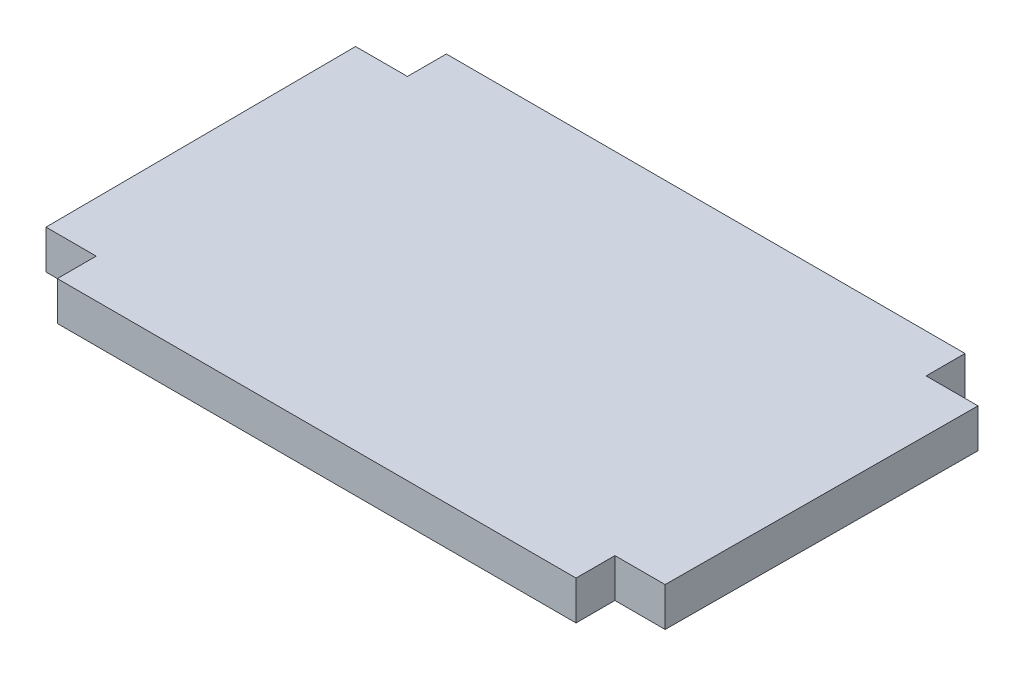
ISO-10303-21;
HEADER;
FILE_DESCRIPTION(('STEP AP214'),'2;1');
FILE_NAME('part.step','',(''),(''),'','','');
FILE_SCHEMA(('AUTOMOTIVE_DESIGN { 1 0 10303 214 1 1 1 1 }'));
ENDSEC;
DATA;
#1=APPLICATION_CONTEXT('core data for automotive mechanical design processes');
#2=APPLICATION_PROTOCOL_DEFINITION('international standard','automotive_design',2000,#1);
#3=PRODUCT_CONTEXT('',#1,'mechanical');
#4=PRODUCT('Part','Part','',(#3));
#5=PRODUCT_RELATED_PRODUCT_CATEGORY('part','',(#4));
#6=PRODUCT_DEFINITION_FORMATION('','',#4);
#7=PRODUCT_DEFINITION_CONTEXT('part definition',#1,'design');
#8=PRODUCT_DEFINITION('design','',#6,#7);
#9=PRODUCT_DEFINITION_SHAPE('','',#8);
#10=(LENGTH_UNIT() NAMED_UNIT(*) SI_UNIT(.MILLI.,.METRE.));
#11=(NAMED_UNIT(*) PLANE_ANGLE_UNIT() SI_UNIT($,.RADIAN.));
#12=(NAMED_UNIT(*) SI_UNIT($,.STERADIAN.) SOLID_ANGLE_UNIT());
#13=UNCERTAINTY_MEASURE_WITH_UNIT(LENGTH_MEASURE(1.E-05),#10,'distance_accuracy_value','');
#14=(GEOMETRIC_REPRESENTATION_CONTEXT(3) GLOBAL_UNCERTAINTY_ASSIGNED_CONTEXT((#13)) GLOBAL_UNIT_ASSIGNED_CONTEXT((#10,
#11,#12)) REPRESENTATION_CONTEXT('',''));
#15=CARTESIAN_POINT('',(0.,0.,0.));
#16=DIRECTION('',(0.,0.,1.));
#17=DIRECTION('',(1.,0.,0.));
#18=AXIS2_PLACEMENT_3D('',#15,#16,#17);
#19=CARTESIAN_POINT('',(0.,3.,11.9996634285159));
#20=DIRECTION('',(0.,0.,-1.));
#21=DIRECTION('',(-1.,0.,0.));
#22=AXIS2_PLACEMENT_3D('',#19,#20,#21);
#23=PLANE('',#22);
#24=DIRECTION('',(1.,0.,0.));
#25=VECTOR('',#24,1.);
#26=CARTESIAN_POINT('',(0.,0.,11.9996634285159));
#27=LINE('',#26,#25);
#28=CARTESIAN_POINT('',(40.,0.,11.9996634285159));
#29=VERTEX_POINT('',#28);
#30=CARTESIAN_POINT('',(43.8728964282242,0.,11.9996634285159));
#31=VERTEX_POINT('',#30);
#32=EDGE_CURVE('E155',#29,#31,#27,.T.);
#33=ORIENTED_EDGE('',*,*,#32,.T.);
#34=DIRECTION('',(0.,-1.,0.));
#35=VECTOR('',#34,1.);
#36=CARTESIAN_POINT('',(43.8728964282242,3.,11.9996634285159));
#37=LINE('',#36,#35);
#38=CARTESIAN_POINT('',(43.8728964282242,3.,11.9996634285159));
#39=VERTEX_POINT('',#38);
#40=EDGE_CURVE('E11',#39,#31,#37,.T.);
#41=ORIENTED_EDGE('',*,*,#40,.F.);
#42=DIRECTION('',(1.,0.,0.));
#43=VECTOR('',#42,1.);
#44=CARTESIAN_POINT('',(0.,3.,11.9996634285159));
#45=LINE('',#44,#43);
#46=CARTESIAN_POINT('',(40.,3.,11.9996634285159));
#47=VERTEX_POINT('',#46);
#48=EDGE_CURVE('E183',#47,#39,#45,.T.);
#49=ORIENTED_EDGE('',*,*,#48,.F.);
#50=DIRECTION('',(0.,-1.,0.));
#51=VECTOR('',#50,1.);
#52=CARTESIAN_POINT('',(40.,3.,11.9996634285159));
#53=LINE('',#52,#51);
#54=EDGE_CURVE('E151',#47,#29,#53,.T.);
#55=ORIENTED_EDGE('',*,*,#54,.T.);
#56=EDGE_LOOP('',(#33,#41,#49,#55));
#57=FACE_BOUND('',#56,.T.);
#58=ADVANCED_FACE('F35',(#57),#23,.F.);
#59=CARTESIAN_POINT('',(43.9352150185619,3.,0.232683377924547));
#60=DIRECTION('',(-0.999985976188161,0.,-0.00529598215732718));
#61=DIRECTION('',(-0.00529598215732718,0.,0.999985976188161));
#62=AXIS2_PLACEMENT_3D('',#59,#60,#61);
#63=PLANE('',#62);
#64=DIRECTION('',(0.00529598215732718,0.,-0.999985976188161));
#65=VECTOR('',#64,1.);
#66=CARTESIAN_POINT('',(43.9352150185619,0.,0.232683377924547));
#67=LINE('',#66,#65);
#68=CARTESIAN_POINT('',(44.,0.,-12.));
#69=VERTEX_POINT('',#68);
#70=EDGE_CURVE('E158',#31,#69,#67,.T.);
#71=ORIENTED_EDGE('',*,*,#70,.T.);
#72=DIRECTION('',(0.,-1.,0.));
#73=VECTOR('',#72,1.);
#74=CARTESIAN_POINT('',(44.,3.,-12.));
#75=LINE('',#74,#73);
#76=CARTESIAN_POINT('',(44.,3.,-12.));
#77=VERTEX_POINT('',#76);
#78=EDGE_CURVE('E43',#77,#69,#75,.T.);
#79=ORIENTED_EDGE('',*,*,#78,.F.);
#80=DIRECTION('',(0.00529598215732718,0.,-0.999985976188161));
#81=VECTOR('',#80,1.);
#82=CARTESIAN_POINT('',(43.9352150185619,3.,0.232683377924547));
#83=LINE('',#82,#81);
#84=EDGE_CURVE('E102',#39,#77,#83,.T.);
#85=ORIENTED_EDGE('',*,*,#84,.F.);
#86=ORIENTED_EDGE('',*,*,#40,.T.);
#87=EDGE_LOOP('',(#71,#79,#85,#86));
#88=FACE_BOUND('',#87,.T.);
#89=ADVANCED_FACE('F206',(#88),#63,.F.);
#90=CARTESIAN_POINT('',(0.,3.,-12.));
#91=DIRECTION('',(0.,0.,-1.));
#92=DIRECTION('',(-1.,0.,0.));
#93=AXIS2_PLACEMENT_3D('',#90,#91,#92);
#94=PLANE('',#93);
#95=DIRECTION('',(1.,0.,0.));
#96=VECTOR('',#95,1.);
#97=CARTESIAN_POINT('',(0.,0.,-12.));
#98=LINE('',#97,#96);
#99=CARTESIAN_POINT('',(40.,0.,-12.));
#100=VERTEX_POINT('',#99);
#101=EDGE_CURVE('E161',#100,#69,#98,.T.);
#102=ORIENTED_EDGE('',*,*,#101,.F.);
#103=DIRECTION('',(0.,-1.,0.));
#104=VECTOR('',#103,1.);
#105=CARTESIAN_POINT('',(40.,3.,-12.));
#106=LINE('',#105,#104);
#107=CARTESIAN_POINT('',(40.,3.,-12.));
#108=VERTEX_POINT('',#107);
#109=EDGE_CURVE('E199',#108,#100,#106,.T.);
#110=ORIENTED_EDGE('',*,*,#109,.F.);
#111=DIRECTION('',(1.,0.,0.));
#112=VECTOR('',#111,1.);
#113=CARTESIAN_POINT('',(0.,3.,-12.));
#114=LINE('',#113,#112);
#115=EDGE_CURVE('E205',#108,#77,#114,.T.);
#116=ORIENTED_EDGE('',*,*,#115,.T.);
#117=ORIENTED_EDGE('',*,*,#78,.T.);
#118=EDGE_LOOP('',(#102,#110,#116,#117));
#119=FACE_BOUND('',#118,.T.);
#120=ADVANCED_FACE('F203',(#119),#94,.T.);
#121=CARTESIAN_POINT('',(40.,3.,0.));
#122=DIRECTION('',(-1.,0.,0.));
#123=DIRECTION('',(0.,0.,1.));
#124=AXIS2_PLACEMENT_3D('',#121,#122,#123);
#125=PLANE('',#124);
#126=DIRECTION('',(0.,0.,-1.));
#127=VECTOR('',#126,1.);
#128=CARTESIAN_POINT('',(40.,0.,0.));
#129=LINE('',#128,#127);
#130=CARTESIAN_POINT('',(40.,0.,-15.));
#131=VERTEX_POINT('',#130);
#132=EDGE_CURVE('E164',#100,#131,#129,.T.);
#133=ORIENTED_EDGE('',*,*,#132,.T.);
#134=DIRECTION('',(0.,-1.,0.));
#135=VECTOR('',#134,1.);
#136=CARTESIAN_POINT('',(40.,3.,-15.));
#137=LINE('',#136,#135);
#138=CARTESIAN_POINT('',(40.,3.,-15.));
#139=VERTEX_POINT('',#138);
#140=EDGE_CURVE('E196',#139,#131,#137,.T.);
#141=ORIENTED_EDGE('',*,*,#140,.F.);
#142=DIRECTION('',(0.,0.,-1.));
#143=VECTOR('',#142,1.);
#144=CARTESIAN_POINT('',(40.,3.,0.));
#145=LINE('',#144,#143);
#146=EDGE_CURVE('E225',#108,#139,#145,.T.);
#147=ORIENTED_EDGE('',*,*,#146,.F.);
#148=ORIENTED_EDGE('',*,*,#109,.T.);
#149=EDGE_LOOP('',(#133,#141,#147,#148));
#150=FACE_BOUND('',#149,.T.);
#151=ADVANCED_FACE('F216',(#150),#125,.F.);
#152=CARTESIAN_POINT('',(0.,3.,-15.));
#153=DIRECTION('',(0.,0.,1.));
#154=DIRECTION('',(1.,0.,0.));
#155=AXIS2_PLACEMENT_3D('',#152,#153,#154);
#156=PLANE('',#155);
#157=DIRECTION('',(-1.,0.,0.));
#158=VECTOR('',#157,1.);
#159=CARTESIAN_POINT('',(0.,0.,-15.));
#160=LINE('',#159,#158);
#161=CARTESIAN_POINT('',(0.,0.,-15.));
#162=VERTEX_POINT('',#161);
#163=EDGE_CURVE('E166',#131,#162,#160,.T.);
#164=ORIENTED_EDGE('',*,*,#163,.T.);
#165=DIRECTION('',(0.,-1.,0.));
#166=VECTOR('',#165,1.);
#167=CARTESIAN_POINT('',(0.,3.,-15.));
#168=LINE('',#167,#166);
#169=CARTESIAN_POINT('',(0.,3.,-15.));
#170=VERTEX_POINT('',#169);
#171=EDGE_CURVE('E193',#170,#162,#168,.T.);
#172=ORIENTED_EDGE('',*,*,#171,.F.);
#173=DIRECTION('',(-1.,0.,0.));
#174=VECTOR('',#173,1.);
#175=CARTESIAN_POINT('',(0.,3.,-15.));
#176=LINE('',#175,#174);
#177=EDGE_CURVE('E222',#139,#170,#176,.T.);
#178=ORIENTED_EDGE('',*,*,#177,.F.);
#179=ORIENTED_EDGE('',*,*,#140,.T.);
#180=EDGE_LOOP('',(#164,#172,#178,#179));
#181=FACE_BOUND('',#180,.T.);
#182=ADVANCED_FACE('F220',(#181),#156,.F.);
#183=CARTESIAN_POINT('',(0.,3.,0.));
#184=DIRECTION('',(1.,0.,0.));
#185=DIRECTION('',(0.,0.,-1.));
#186=AXIS2_PLACEMENT_3D('',#183,#184,#185);
#187=PLANE('',#186);
#188=DIRECTION('',(0.,0.,1.));
#189=VECTOR('',#188,1.);
#190=CARTESIAN_POINT('',(0.,0.,0.));
#191=LINE('',#190,#189);
#192=CARTESIAN_POINT('',(0.,0.,-12.));
#193=VERTEX_POINT('',#192);
#194=EDGE_CURVE('E168',#162,#193,#191,.T.);
#195=ORIENTED_EDGE('',*,*,#194,.T.);
#196=DIRECTION('',(0.,-1.,0.));
#197=VECTOR('',#196,1.);
#198=CARTESIAN_POINT('',(0.,3.,-12.));
#199=LINE('',#198,#197);
#200=CARTESIAN_POINT('',(0.,3.,-12.));
#201=VERTEX_POINT('',#200);
#202=EDGE_CURVE('E191',#201,#193,#199,.T.);
#203=ORIENTED_EDGE('',*,*,#202,.F.);
#204=DIRECTION('',(0.,0.,1.));
#205=VECTOR('',#204,1.);
#206=CARTESIAN_POINT('',(0.,3.,0.));
#207=LINE('',#206,#205);
#208=EDGE_CURVE('E224',#170,#201,#207,.T.);
#209=ORIENTED_EDGE('',*,*,#208,.F.);
#210=ORIENTED_EDGE('',*,*,#171,.T.);
#211=EDGE_LOOP('',(#195,#203,#209,#210));
#212=FACE_BOUND('',#211,.T.);
#213=ADVANCED_FACE('F315',(#212),#187,.F.);
#214=CARTESIAN_POINT('',(0.,3.,-12.));
#215=DIRECTION('',(0.,0.,-1.));
#216=DIRECTION('',(-1.,0.,0.));
#217=AXIS2_PLACEMENT_3D('',#214,#215,#216);
#218=PLANE('',#217);
#219=DIRECTION('',(1.,0.,0.));
#220=VECTOR('',#219,1.);
#221=CARTESIAN_POINT('',(0.,0.,-12.));
#222=LINE('',#221,#220);
#223=CARTESIAN_POINT('',(-3.99999999999999,0.,-12.));
#224=VERTEX_POINT('',#223);
#225=EDGE_CURVE('E171',#224,#193,#222,.T.);
#226=ORIENTED_EDGE('',*,*,#225,.F.);
#227=DIRECTION('',(0.,-1.,0.));
#228=VECTOR('',#227,1.);
#229=CARTESIAN_POINT('',(-3.99999999999999,3.,-12.));
#230=LINE('',#229,#228);
#231=CARTESIAN_POINT('',(-3.99999999999999,3.,-12.));
#232=VERTEX_POINT('',#231);
#233=EDGE_CURVE('E189',#232,#224,#230,.T.);
#234=ORIENTED_EDGE('',*,*,#233,.F.);
#235=DIRECTION('',(1.,0.,0.));
#236=VECTOR('',#235,1.);
#237=CARTESIAN_POINT('',(0.,3.,-12.));
#238=LINE('',#237,#236);
#239=EDGE_CURVE('E227',#232,#201,#238,.T.);
#240=ORIENTED_EDGE('',*,*,#239,.T.);
#241=ORIENTED_EDGE('',*,*,#202,.T.);
#242=EDGE_LOOP('',(#226,#234,#240,#241));
#243=FACE_BOUND('',#242,.T.);
#244=ADVANCED_FACE('F243',(#243),#218,.T.);
#245=CARTESIAN_POINT('',(-3.9363369156423,3.,0.0208470624257507));
#246=DIRECTION('',(-0.999985976188161,0.,0.00529598215732716));
#247=DIRECTION('',(0.00529598215732716,0.,0.999985976188161));
#248=AXIS2_PLACEMENT_3D('',#245,#246,#247);
#249=PLANE('',#248);
#250=DIRECTION('',(-0.00529598215732716,0.,-0.999985976188161));
#251=VECTOR('',#250,1.);
#252=CARTESIAN_POINT('',(-3.9363369156423,0.,0.0208470624257507));
#253=LINE('',#252,#251);
#254=CARTESIAN_POINT('',(-3.87289642822413,0.,11.9996634285159));
#255=VERTEX_POINT('',#254);
#256=EDGE_CURVE('E174',#255,#224,#253,.T.);
#257=ORIENTED_EDGE('',*,*,#256,.F.);
#258=DIRECTION('',(0.,-1.,0.));
#259=VECTOR('',#258,1.);
#260=CARTESIAN_POINT('',(-3.87289642822413,3.,11.9996634285159));
#261=LINE('',#260,#259);
#262=CARTESIAN_POINT('',(-3.87289642822413,3.,11.9996634285159));
#263=VERTEX_POINT('',#262);
#264=EDGE_CURVE('E187',#263,#255,#261,.T.);
#265=ORIENTED_EDGE('',*,*,#264,.F.);
#266=DIRECTION('',(-0.00529598215732716,0.,-0.999985976188161));
#267=VECTOR('',#266,1.);
#268=CARTESIAN_POINT('',(-3.9363369156423,3.,0.0208470624257507));
#269=LINE('',#268,#267);
#270=EDGE_CURVE('E234',#263,#232,#269,.T.);
#271=ORIENTED_EDGE('',*,*,#270,.T.);
#272=ORIENTED_EDGE('',*,*,#233,.T.);
#273=EDGE_LOOP('',(#257,#265,#271,#272));
#274=FACE_BOUND('',#273,.T.);
#275=ADVANCED_FACE('F238',(#274),#249,.T.);
#276=CARTESIAN_POINT('',(0.,3.,11.9996634285159));
#277=DIRECTION('',(0.,0.,-1.));
#278=DIRECTION('',(-1.,0.,0.));
#279=AXIS2_PLACEMENT_3D('',#276,#277,#278);
#280=PLANE('',#279);
#281=DIRECTION('',(1.,0.,0.));
#282=VECTOR('',#281,1.);
#283=CARTESIAN_POINT('',(0.,0.,11.9996634285159));
#284=LINE('',#283,#282);
#285=CARTESIAN_POINT('',(0.,0.,11.9996634285159));
#286=VERTEX_POINT('',#285);
#287=EDGE_CURVE('E177',#255,#286,#284,.T.);
#288=ORIENTED_EDGE('',*,*,#287,.T.);
#289=DIRECTION('',(0.,-1.,0.));
#290=VECTOR('',#289,1.);
#291=CARTESIAN_POINT('',(0.,3.,11.9996634285159));
#292=LINE('',#291,#290);
#293=CARTESIAN_POINT('',(0.,3.,11.9996634285159));
#294=VERTEX_POINT('',#293);
#295=EDGE_CURVE('E147',#294,#286,#292,.T.);
#296=ORIENTED_EDGE('',*,*,#295,.F.);
#297=DIRECTION('',(1.,0.,0.));
#298=VECTOR('',#297,1.);
#299=CARTESIAN_POINT('',(0.,3.,11.9996634285159));
#300=LINE('',#299,#298);
#301=EDGE_CURVE('E134',#263,#294,#300,.T.);
#302=ORIENTED_EDGE('',*,*,#301,.F.);
#303=ORIENTED_EDGE('',*,*,#264,.T.);
#304=EDGE_LOOP('',(#288,#296,#302,#303));
#305=FACE_BOUND('',#304,.T.);
#306=ADVANCED_FACE('F246',(#305),#280,.F.);
#307=CARTESIAN_POINT('',(0.,3.,0.));
#308=DIRECTION('',(1.,0.,0.));
#309=DIRECTION('',(0.,0.,-1.));
#310=AXIS2_PLACEMENT_3D('',#307,#308,#309);
#311=PLANE('',#310);
#312=DIRECTION('',(0.,0.,1.));
#313=VECTOR('',#312,1.);
#314=CARTESIAN_POINT('',(0.,0.,0.));
#315=LINE('',#314,#313);
#316=CARTESIAN_POINT('',(0.,0.,14.9996634285159));
#317=VERTEX_POINT('',#316);
#318=EDGE_CURVE('E143',#286,#317,#315,.T.);
#319=ORIENTED_EDGE('',*,*,#318,.T.);
#320=DIRECTION('',(0.,-1.,0.));
#321=VECTOR('',#320,1.);
#322=CARTESIAN_POINT('',(0.,3.,14.9996634285159));
#323=LINE('',#322,#321);
#324=CARTESIAN_POINT('',(0.,3.,14.9996634285159));
#325=VERTEX_POINT('',#324);
#326=EDGE_CURVE('E140',#325,#317,#323,.T.);
#327=ORIENTED_EDGE('',*,*,#326,.F.);
#328=DIRECTION('',(0.,0.,1.));
#329=VECTOR('',#328,1.);
#330=CARTESIAN_POINT('',(0.,3.,0.));
#331=LINE('',#330,#329);
#332=EDGE_CURVE('E127',#294,#325,#331,.T.);
#333=ORIENTED_EDGE('',*,*,#332,.F.);
#334=ORIENTED_EDGE('',*,*,#295,.T.);
#335=EDGE_LOOP('',(#319,#327,#333,#334));
#336=FACE_BOUND('',#335,.T.);
#337=ADVANCED_FACE('F141',(#336),#311,.F.);
#338=CARTESIAN_POINT('',(0.,3.,14.9996634285159));
#339=DIRECTION('',(0.,0.,1.));
#340=DIRECTION('',(1.,0.,0.));
#341=AXIS2_PLACEMENT_3D('',#338,#339,#340);
#342=PLANE('',#341);
#343=DIRECTION('',(-1.,0.,0.));
#344=VECTOR('',#343,1.);
#345=CARTESIAN_POINT('',(0.,0.,14.9996634285159));
#346=LINE('',#345,#344);
#347=CARTESIAN_POINT('',(40.,0.,14.9996634285159));
#348=VERTEX_POINT('',#347);
#349=EDGE_CURVE('E180',#348,#317,#346,.T.);
#350=ORIENTED_EDGE('',*,*,#349,.F.);
#351=DIRECTION('',(0.,-1.,0.));
#352=VECTOR('',#351,1.);
#353=CARTESIAN_POINT('',(40.,3.,14.9996634285159));
#354=LINE('',#353,#352);
#355=CARTESIAN_POINT('',(40.,3.,14.9996634285159));
#356=VERTEX_POINT('',#355);
#357=EDGE_CURVE('E91',#356,#348,#354,.T.);
#358=ORIENTED_EDGE('',*,*,#357,.F.);
#359=DIRECTION('',(-1.,0.,0.));
#360=VECTOR('',#359,1.);
#361=CARTESIAN_POINT('',(0.,3.,14.9996634285159));
#362=LINE('',#361,#360);
#363=EDGE_CURVE('E131',#356,#325,#362,.T.);
#364=ORIENTED_EDGE('',*,*,#363,.T.);
#365=ORIENTED_EDGE('',*,*,#326,.T.);
#366=EDGE_LOOP('',(#350,#358,#364,#365));
#367=FACE_BOUND('',#366,.T.);
#368=ADVANCED_FACE('F149',(#367),#342,.T.);
#369=CARTESIAN_POINT('',(40.,3.,0.));
#370=DIRECTION('',(-1.,0.,0.));
#371=DIRECTION('',(0.,0.,1.));
#372=AXIS2_PLACEMENT_3D('',#369,#370,#371);
#373=PLANE('',#372);
#374=DIRECTION('',(0.,0.,-1.));
#375=VECTOR('',#374,1.);
#376=CARTESIAN_POINT('',(40.,0.,0.));
#377=LINE('',#376,#375);
#378=EDGE_CURVE('E94',#348,#29,#377,.T.);
#379=ORIENTED_EDGE('',*,*,#378,.T.);
#380=ORIENTED_EDGE('',*,*,#54,.F.);
#381=DIRECTION('',(0.,0.,-1.));
#382=VECTOR('',#381,1.);
#383=CARTESIAN_POINT('',(40.,3.,0.));
#384=LINE('',#383,#382);
#385=EDGE_CURVE('E51',#356,#47,#384,.T.);
#386=ORIENTED_EDGE('',*,*,#385,.F.);
#387=ORIENTED_EDGE('',*,*,#357,.T.);
#388=EDGE_LOOP('',(#379,#380,#386,#387));
#389=FACE_BOUND('',#388,.T.);
#390=ADVANCED_FACE('F261',(#389),#373,.F.);
#391=CARTESIAN_POINT('',(0.,3.,0.));
#392=DIRECTION('',(0.,1.,0.));
#393=DIRECTION('',(0.,0.,1.));
#394=AXIS2_PLACEMENT_3D('',#391,#392,#393);
#395=PLANE('',#394);
#396=ORIENTED_EDGE('',*,*,#48,.T.);
#397=ORIENTED_EDGE('',*,*,#84,.T.);
#398=ORIENTED_EDGE('',*,*,#115,.F.);
#399=ORIENTED_EDGE('',*,*,#146,.T.);
#400=ORIENTED_EDGE('',*,*,#177,.T.);
#401=ORIENTED_EDGE('',*,*,#208,.T.);
#402=ORIENTED_EDGE('',*,*,#239,.F.);
#403=ORIENTED_EDGE('',*,*,#270,.F.);
#404=ORIENTED_EDGE('',*,*,#301,.T.);
#405=ORIENTED_EDGE('',*,*,#332,.T.);
#406=ORIENTED_EDGE('',*,*,#363,.F.);
#407=ORIENTED_EDGE('',*,*,#385,.T.);
#408=EDGE_LOOP('',(#396,#397,#398,#399,#400,#401,#402,#403,#404,#405,#406,#407));
#409=FACE_BOUND('',#408,.T.);
#410=ADVANCED_FACE('F129',(#409),#395,.T.);
#411=CARTESIAN_POINT('',(0.,0.,0.));
#412=DIRECTION('',(0.,1.,0.));
#413=DIRECTION('',(0.,0.,1.));
#414=AXIS2_PLACEMENT_3D('',#411,#412,#413);
#415=PLANE('',#414);
#416=ORIENTED_EDGE('',*,*,#32,.F.);
#417=ORIENTED_EDGE('',*,*,#378,.F.);
#418=ORIENTED_EDGE('',*,*,#349,.T.);
#419=ORIENTED_EDGE('',*,*,#318,.F.);
#420=ORIENTED_EDGE('',*,*,#287,.F.);
#421=ORIENTED_EDGE('',*,*,#256,.T.);
#422=ORIENTED_EDGE('',*,*,#225,.T.);
#423=ORIENTED_EDGE('',*,*,#194,.F.);
#424=ORIENTED_EDGE('',*,*,#163,.F.);
#425=ORIENTED_EDGE('',*,*,#132,.F.);
#426=ORIENTED_EDGE('',*,*,#101,.T.);
#427=ORIENTED_EDGE('',*,*,#70,.F.);
#428=EDGE_LOOP('',(#416,#417,#418,#419,#420,#421,#422,#423,#424,#425,#426,#427));
#429=FACE_BOUND('',#428,.T.);
#430=ADVANCED_FACE('F211',(#429),#415,.F.);
#431=CLOSED_SHELL('',(#58,#89,#120,#151,#182,#213,#244,#275,#306,#337,#368,#390,#410,#430));
#432=MANIFOLD_SOLID_BREP('B2',#431);
#433=ADVANCED_BREP_SHAPE_REPRESENTATION('',(#18,#432),#14);
#434=SHAPE_DEFINITION_REPRESENTATION(#9,#433);
ENDSEC;
END-ISO-10303-21;
